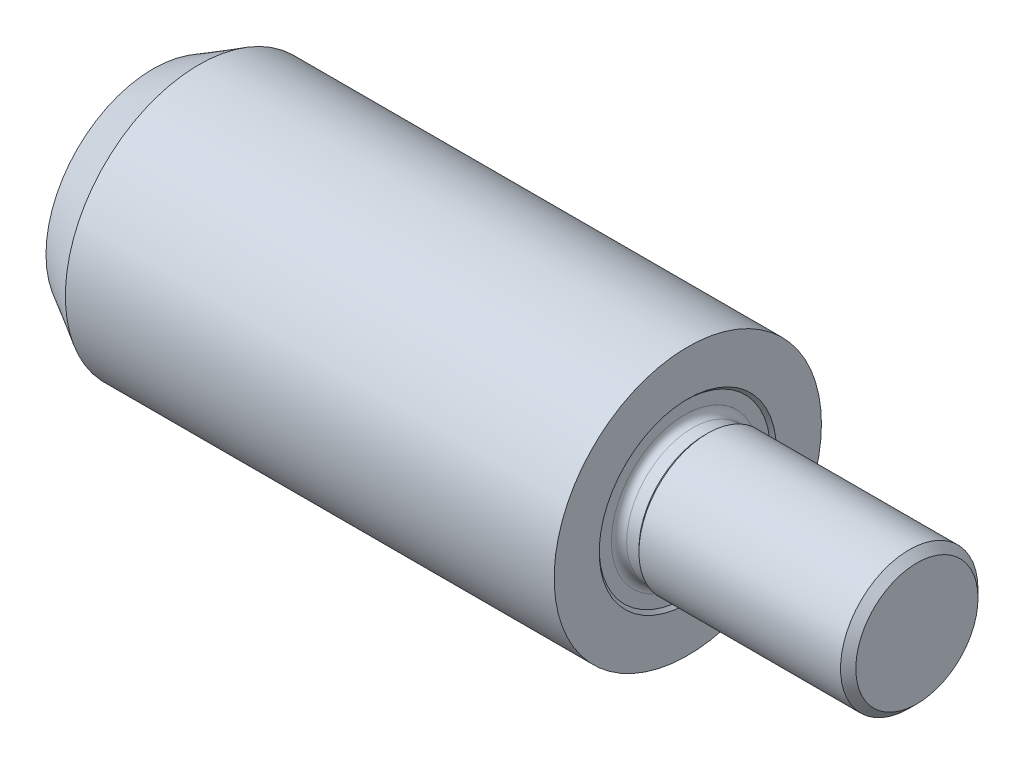
ISO-10303-21;
HEADER;
FILE_DESCRIPTION(('STEP AP214'),'2;1');
FILE_NAME('part.step','',(''),(''),'','','');
FILE_SCHEMA(('AUTOMOTIVE_DESIGN { 1 0 10303 214 1 1 1 1 }'));
ENDSEC;
DATA;
#1=APPLICATION_CONTEXT('core data for automotive mechanical design processes');
#2=APPLICATION_PROTOCOL_DEFINITION('international standard','automotive_design',2000,#1);
#3=PRODUCT_CONTEXT('',#1,'mechanical');
#4=PRODUCT('Part','Part','',(#3));
#5=PRODUCT_RELATED_PRODUCT_CATEGORY('part','',(#4));
#6=PRODUCT_DEFINITION_FORMATION('','',#4);
#7=PRODUCT_DEFINITION_CONTEXT('part definition',#1,'design');
#8=PRODUCT_DEFINITION('design','',#6,#7);
#9=PRODUCT_DEFINITION_SHAPE('','',#8);
#10=(LENGTH_UNIT() NAMED_UNIT(*) SI_UNIT(.MILLI.,.METRE.));
#11=(NAMED_UNIT(*) PLANE_ANGLE_UNIT() SI_UNIT($,.RADIAN.));
#12=(NAMED_UNIT(*) SI_UNIT($,.STERADIAN.) SOLID_ANGLE_UNIT());
#13=UNCERTAINTY_MEASURE_WITH_UNIT(LENGTH_MEASURE(1.E-05),#10,'distance_accuracy_value','');
#14=(GEOMETRIC_REPRESENTATION_CONTEXT(3) GLOBAL_UNCERTAINTY_ASSIGNED_CONTEXT((#13)) GLOBAL_UNIT_ASSIGNED_CONTEXT((#10,
#11,#12)) REPRESENTATION_CONTEXT('',''));
#15=CARTESIAN_POINT('',(0.,0.,0.));
#16=DIRECTION('',(0.,0.,1.));
#17=DIRECTION('',(1.,0.,0.));
#18=AXIS2_PLACEMENT_3D('',#15,#16,#17);
#19=CARTESIAN_POINT('',(0.,0.,0.));
#20=DIRECTION('',(-1.,0.,0.));
#21=DIRECTION('',(0.,0.,1.));
#22=AXIS2_PLACEMENT_3D('',#19,#20,#21);
#23=PLANE('',#22);
#24=CARTESIAN_POINT('',(0.,0.,0.));
#25=DIRECTION('',(1.,0.,0.));
#26=DIRECTION('',(0.,0.,-1.));
#27=AXIS2_PLACEMENT_3D('',#24,#25,#26);
#28=CIRCLE('',#27,14.0358983848622);
#29=CARTESIAN_POINT('',(0.,0.,-14.0358983848622));
#30=VERTEX_POINT('',#29);
#31=EDGE_CURVE('E73',#30,#30,#28,.T.);
#32=ORIENTED_EDGE('',*,*,#31,.F.);
#33=EDGE_LOOP('',(#32));
#34=FACE_BOUND('',#33,.T.);
#35=ADVANCED_FACE('F39',(#34),#23,.T.);
#36=CARTESIAN_POINT('',(6.00000000000001,0.,0.));
#37=DIRECTION('',(1.,0.,0.));
#38=DIRECTION('',(0.,0.,-1.));
#39=AXIS2_PLACEMENT_3D('',#36,#37,#38);
#40=CONICAL_SURFACE('',#39,17.5,0.523598775598299);
#41=ORIENTED_EDGE('',*,*,#31,.T.);
#42=EDGE_LOOP('',(#41));
#43=FACE_BOUND('',#42,.T.);
#44=CARTESIAN_POINT('',(6.00000000000001,0.,0.));
#45=DIRECTION('',(1.,0.,0.));
#46=DIRECTION('',(0.,0.,-1.));
#47=AXIS2_PLACEMENT_3D('',#44,#45,#46);
#48=CIRCLE('',#47,17.5);
#49=CARTESIAN_POINT('',(6.00000000000001,0.,-17.5));
#50=VERTEX_POINT('',#49);
#51=EDGE_CURVE('E76',#50,#50,#48,.T.);
#52=ORIENTED_EDGE('',*,*,#51,.F.);
#53=EDGE_LOOP('',(#52));
#54=FACE_BOUND('',#53,.T.);
#55=ADVANCED_FACE('F86',(#43,#54),#40,.T.);
#56=CARTESIAN_POINT('',(100.,0.,0.));
#57=DIRECTION('',(1.,0.,0.));
#58=DIRECTION('',(0.,0.,-1.));
#59=AXIS2_PLACEMENT_3D('',#56,#57,#58);
#60=CYLINDRICAL_SURFACE('',#59,17.5);
#61=ORIENTED_EDGE('',*,*,#51,.T.);
#62=EDGE_LOOP('',(#61));
#63=FACE_BOUND('',#62,.T.);
#64=CARTESIAN_POINT('',(70.,0.,0.));
#65=DIRECTION('',(1.,0.,0.));
#66=DIRECTION('',(0.,0.,-1.));
#67=AXIS2_PLACEMENT_3D('',#64,#65,#66);
#68=CIRCLE('',#67,17.5);
#69=CARTESIAN_POINT('',(70.,0.,-17.5));
#70=VERTEX_POINT('',#69);
#71=EDGE_CURVE('E64',#70,#70,#68,.T.);
#72=ORIENTED_EDGE('',*,*,#71,.F.);
#73=EDGE_LOOP('',(#72));
#74=FACE_BOUND('',#73,.T.);
#75=ADVANCED_FACE('F84',(#63,#74),#60,.T.);
#76=CARTESIAN_POINT('',(70.,17.5,0.));
#77=DIRECTION('',(1.,0.,0.));
#78=DIRECTION('',(0.,0.,-1.));
#79=AXIS2_PLACEMENT_3D('',#76,#77,#78);
#80=PLANE('',#79);
#81=CARTESIAN_POINT('',(70.,0.,0.));
#82=DIRECTION('',(1.,0.,0.));
#83=DIRECTION('',(0.,0.,-1.));
#84=AXIS2_PLACEMENT_3D('',#81,#82,#83);
#85=CIRCLE('',#84,11.6);
#86=CARTESIAN_POINT('',(70.,0.,-11.6));
#87=VERTEX_POINT('',#86);
#88=EDGE_CURVE('E61',#87,#87,#85,.F.);
#89=ORIENTED_EDGE('',*,*,#88,.T.);
#90=EDGE_LOOP('',(#89));
#91=FACE_BOUND('',#90,.T.);
#92=ORIENTED_EDGE('',*,*,#71,.T.);
#93=EDGE_LOOP('',(#92));
#94=FACE_BOUND('',#93,.T.);
#95=ADVANCED_FACE('F82',(#91,#94),#80,.T.);
#96=CARTESIAN_POINT('',(66.5004540262063,0.,0.));
#97=DIRECTION('',(-1.,0.,0.));
#98=DIRECTION('',(0.,0.,1.));
#99=AXIS2_PLACEMENT_3D('',#96,#97,#98);
#100=CYLINDRICAL_SURFACE('',#99,8.6);
#101=CARTESIAN_POINT('',(72.2,0.,0.));
#102=DIRECTION('',(-1.,0.,0.));
#103=DIRECTION('',(0.,0.,1.));
#104=AXIS2_PLACEMENT_3D('',#101,#102,#103);
#105=CIRCLE('',#104,8.6);
#106=CARTESIAN_POINT('',(72.2,0.,8.6));
#107=VERTEX_POINT('',#106);
#108=EDGE_CURVE('E10',#107,#107,#105,.T.);
#109=ORIENTED_EDGE('',*,*,#108,.T.);
#110=EDGE_LOOP('',(#109));
#111=FACE_BOUND('',#110,.T.);
#112=CARTESIAN_POINT('',(70.6,0.,0.));
#113=DIRECTION('',(1.,0.,0.));
#114=DIRECTION('',(0.,0.,-1.));
#115=AXIS2_PLACEMENT_3D('',#112,#113,#114);
#116=CIRCLE('',#115,8.6);
#117=CARTESIAN_POINT('',(70.6,0.,-8.6));
#118=VERTEX_POINT('',#117);
#119=EDGE_CURVE('E51',#118,#118,#116,.T.);
#120=ORIENTED_EDGE('',*,*,#119,.T.);
#121=EDGE_LOOP('',(#120));
#122=FACE_BOUND('',#121,.T.);
#123=ADVANCED_FACE('F94',(#111,#122),#100,.T.);
#124=CARTESIAN_POINT('',(69.6,11.6,0.));
#125=DIRECTION('',(1.,0.,0.));
#126=DIRECTION('',(0.,0.,-1.));
#127=AXIS2_PLACEMENT_3D('',#124,#125,#126);
#128=PLANE('',#127);
#129=CARTESIAN_POINT('',(69.6,0.,0.));
#130=DIRECTION('',(1.,0.,0.));
#131=DIRECTION('',(0.,0.,-1.));
#132=AXIS2_PLACEMENT_3D('',#129,#130,#131);
#133=CIRCLE('',#132,11.2);
#134=CARTESIAN_POINT('',(69.6,0.,-11.2));
#135=VERTEX_POINT('',#134);
#136=EDGE_CURVE('E47',#135,#135,#133,.T.);
#137=ORIENTED_EDGE('',*,*,#136,.T.);
#138=EDGE_LOOP('',(#137));
#139=FACE_BOUND('',#138,.T.);
#140=CARTESIAN_POINT('',(69.6,0.,0.));
#141=DIRECTION('',(1.,0.,0.));
#142=DIRECTION('',(0.,0.,-1.));
#143=AXIS2_PLACEMENT_3D('',#140,#141,#142);
#144=CIRCLE('',#143,9.6);
#145=CARTESIAN_POINT('',(69.6,0.,-9.6));
#146=VERTEX_POINT('',#145);
#147=EDGE_CURVE('E55',#146,#146,#144,.F.);
#148=ORIENTED_EDGE('',*,*,#147,.T.);
#149=EDGE_LOOP('',(#148));
#150=FACE_BOUND('',#149,.T.);
#151=ADVANCED_FACE('F143',(#139,#150),#128,.T.);
#152=CARTESIAN_POINT('',(100.,9.,0.));
#153=DIRECTION('',(1.,0.,0.));
#154=DIRECTION('',(0.,0.,-1.));
#155=AXIS2_PLACEMENT_3D('',#152,#153,#154);
#156=PLANE('',#155);
#157=CARTESIAN_POINT('',(100.,0.,0.));
#158=DIRECTION('',(1.,0.,0.));
#159=DIRECTION('',(0.,0.,-1.));
#160=AXIS2_PLACEMENT_3D('',#157,#158,#159);
#161=CIRCLE('',#160,7.99999999999999);
#162=CARTESIAN_POINT('',(100.,0.,-7.99999999999999));
#163=VERTEX_POINT('',#162);
#164=EDGE_CURVE('E70',#163,#163,#161,.T.);
#165=ORIENTED_EDGE('',*,*,#164,.T.);
#166=EDGE_LOOP('',(#165));
#167=FACE_BOUND('',#166,.T.);
#168=ADVANCED_FACE('F114',(#167),#156,.T.);
#169=CARTESIAN_POINT('',(100.,0.,0.));
#170=DIRECTION('',(-1.,0.,0.));
#171=DIRECTION('',(0.,0.,1.));
#172=AXIS2_PLACEMENT_3D('',#169,#170,#171);
#173=CONICAL_SURFACE('',#172,7.99999999999999,0.785398163397449);
#174=CARTESIAN_POINT('',(99.,0.,0.));
#175=DIRECTION('',(1.,0.,0.));
#176=DIRECTION('',(0.,0.,-1.));
#177=AXIS2_PLACEMENT_3D('',#174,#175,#176);
#178=CIRCLE('',#177,9.);
#179=CARTESIAN_POINT('',(99.,0.,-9.));
#180=VERTEX_POINT('',#179);
#181=EDGE_CURVE('E60',#180,#180,#178,.F.);
#182=ORIENTED_EDGE('',*,*,#181,.F.);
#183=EDGE_LOOP('',(#182));
#184=FACE_BOUND('',#183,.T.);
#185=ORIENTED_EDGE('',*,*,#164,.F.);
#186=EDGE_LOOP('',(#185));
#187=FACE_BOUND('',#186,.T.);
#188=ADVANCED_FACE('F107',(#184,#187),#173,.T.);
#189=CARTESIAN_POINT('',(100.,0.,0.));
#190=DIRECTION('',(1.,0.,0.));
#191=DIRECTION('',(0.,0.,-1.));
#192=AXIS2_PLACEMENT_3D('',#189,#190,#191);
#193=CYLINDRICAL_SURFACE('',#192,9.);
#194=ORIENTED_EDGE('',*,*,#181,.T.);
#195=EDGE_LOOP('',(#194));
#196=FACE_BOUND('',#195,.T.);
#197=CARTESIAN_POINT('',(72.6,0.,0.));
#198=DIRECTION('',(-1.,0.,0.));
#199=DIRECTION('',(0.,0.,1.));
#200=AXIS2_PLACEMENT_3D('',#197,#198,#199);
#201=CIRCLE('',#200,9.);
#202=CARTESIAN_POINT('',(72.6,0.,9.));
#203=VERTEX_POINT('',#202);
#204=EDGE_CURVE('E65',#203,#203,#201,.F.);
#205=ORIENTED_EDGE('',*,*,#204,.T.);
#206=EDGE_LOOP('',(#205));
#207=FACE_BOUND('',#206,.T.);
#208=ADVANCED_FACE('F113',(#196,#207),#193,.T.);
#209=CARTESIAN_POINT('',(70.6,0.,0.));
#210=DIRECTION('',(1.,0.,0.));
#211=DIRECTION('',(0.,0.,-1.));
#212=AXIS2_PLACEMENT_3D('',#209,#210,#211);
#213=TOROIDAL_SURFACE('',#212,9.6,1.);
#214=ORIENTED_EDGE('',*,*,#119,.F.);
#215=EDGE_LOOP('',(#214));
#216=FACE_BOUND('',#215,.T.);
#217=ORIENTED_EDGE('',*,*,#147,.F.);
#218=EDGE_LOOP('',(#217));
#219=FACE_BOUND('',#218,.T.);
#220=ADVANCED_FACE('F116',(#216,#219),#213,.F.);
#221=CARTESIAN_POINT('',(70.,0.,0.));
#222=DIRECTION('',(1.,0.,0.));
#223=DIRECTION('',(0.,0.,-1.));
#224=AXIS2_PLACEMENT_3D('',#221,#222,#223);
#225=CONICAL_SURFACE('',#224,11.6,0.785398163397444);
#226=ORIENTED_EDGE('',*,*,#136,.F.);
#227=EDGE_LOOP('',(#226));
#228=FACE_BOUND('',#227,.T.);
#229=ORIENTED_EDGE('',*,*,#88,.F.);
#230=EDGE_LOOP('',(#229));
#231=FACE_BOUND('',#230,.T.);
#232=ADVANCED_FACE('F118',(#228,#231),#225,.F.);
#233=CARTESIAN_POINT('',(72.2,0.,0.));
#234=DIRECTION('',(1.,0.,0.));
#235=DIRECTION('',(0.,0.,-1.));
#236=AXIS2_PLACEMENT_3D('',#233,#234,#235);
#237=CONICAL_SURFACE('',#236,8.6,0.785398163397431);
#238=ORIENTED_EDGE('',*,*,#204,.F.);
#239=EDGE_LOOP('',(#238));
#240=FACE_BOUND('',#239,.T.);
#241=ORIENTED_EDGE('',*,*,#108,.F.);
#242=EDGE_LOOP('',(#241));
#243=FACE_BOUND('',#242,.T.);
#244=ADVANCED_FACE('F42',(#240,#243),#237,.T.);
#245=CLOSED_SHELL('',(#35,#55,#75,#95,#123,#151,#168,#188,#208,#220,#232,#244));
#246=MANIFOLD_SOLID_BREP('B2',#245);
#247=ADVANCED_BREP_SHAPE_REPRESENTATION('',(#18,#246),#14);
#248=SHAPE_DEFINITION_REPRESENTATION(#9,#247);
ENDSEC;
END-ISO-10303-21;
